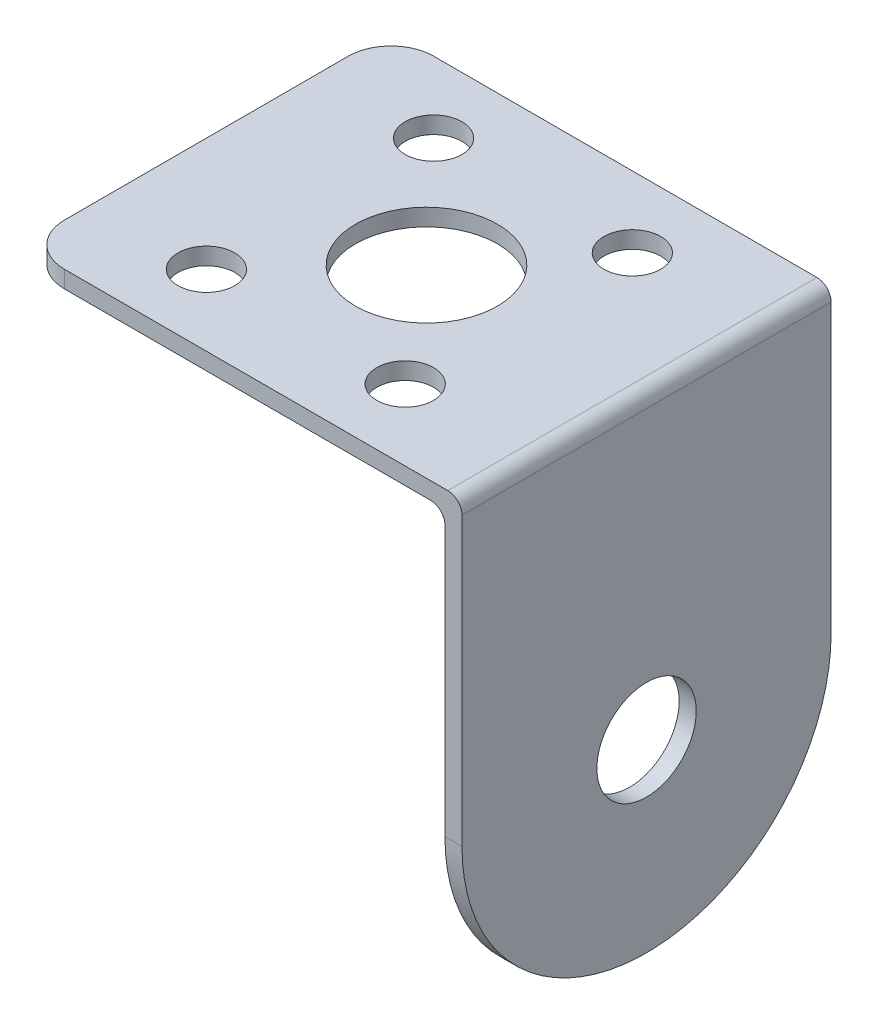
ISO-10303-21;
HEADER;
FILE_DESCRIPTION(('STEP AP214'),'2;1');
FILE_NAME('part.step','',(''),(''),'','','');
FILE_SCHEMA(('AUTOMOTIVE_DESIGN { 1 0 10303 214 1 1 1 1 }'));
ENDSEC;
DATA;
#1=APPLICATION_CONTEXT('core data for automotive mechanical design processes');
#2=APPLICATION_PROTOCOL_DEFINITION('international standard','automotive_design',2000,#1);
#3=PRODUCT_CONTEXT('',#1,'mechanical');
#4=PRODUCT('Part','Part','',(#3));
#5=PRODUCT_RELATED_PRODUCT_CATEGORY('part','',(#4));
#6=PRODUCT_DEFINITION_FORMATION('','',#4);
#7=PRODUCT_DEFINITION_CONTEXT('part definition',#1,'design');
#8=PRODUCT_DEFINITION('design','',#6,#7);
#9=PRODUCT_DEFINITION_SHAPE('','',#8);
#10=(LENGTH_UNIT() NAMED_UNIT(*) SI_UNIT(.MILLI.,.METRE.));
#11=(NAMED_UNIT(*) PLANE_ANGLE_UNIT() SI_UNIT($,.RADIAN.));
#12=(NAMED_UNIT(*) SI_UNIT($,.STERADIAN.) SOLID_ANGLE_UNIT());
#13=UNCERTAINTY_MEASURE_WITH_UNIT(LENGTH_MEASURE(1.E-05),#10,'distance_accuracy_value','');
#14=(GEOMETRIC_REPRESENTATION_CONTEXT(3) GLOBAL_UNCERTAINTY_ASSIGNED_CONTEXT((#13)) GLOBAL_UNIT_ASSIGNED_CONTEXT((#10,
#11,#12)) REPRESENTATION_CONTEXT('',''));
#15=CARTESIAN_POINT('',(0.,0.,0.));
#16=DIRECTION('',(0.,0.,1.));
#17=DIRECTION('',(1.,0.,0.));
#18=AXIS2_PLACEMENT_3D('',#15,#16,#17);
#19=CARTESIAN_POINT('',(15.5,1.2,-13.));
#20=DIRECTION('',(-1.,0.,0.));
#21=DIRECTION('',(0.,0.,1.));
#22=AXIS2_PLACEMENT_3D('',#19,#20,#21);
#23=PLANE('',#22);
#24=CARTESIAN_POINT('',(15.5,-20.,0.));
#25=DIRECTION('',(1.,0.,0.));
#26=DIRECTION('',(0.,0.,-1.));
#27=AXIS2_PLACEMENT_3D('',#24,#25,#26);
#28=CIRCLE('',#27,3.5);
#29=CARTESIAN_POINT('',(15.5,-20.,-3.5));
#30=VERTEX_POINT('',#29);
#31=EDGE_CURVE('E173',#30,#30,#28,.T.);
#32=ORIENTED_EDGE('',*,*,#31,.F.);
#33=EDGE_LOOP('',(#32));
#34=FACE_BOUND('',#33,.T.);
#35=DIRECTION('',(0.,-1.,0.));
#36=VECTOR('',#35,1.);
#37=CARTESIAN_POINT('',(15.5,1.2,-13.));
#38=LINE('',#37,#36);
#39=CARTESIAN_POINT('',(15.5,0.2,-13.));
#40=VERTEX_POINT('',#39);
#41=CARTESIAN_POINT('',(15.5,-20.,-13.));
#42=VERTEX_POINT('',#41);
#43=EDGE_CURVE('E170',#40,#42,#38,.T.);
#44=ORIENTED_EDGE('',*,*,#43,.F.);
#45=DIRECTION('',(0.,0.,-1.));
#46=VECTOR('',#45,1.);
#47=CARTESIAN_POINT('',(15.5,0.2,-13.));
#48=LINE('',#47,#46);
#49=CARTESIAN_POINT('',(15.5,0.2,13.));
#50=VERTEX_POINT('',#49);
#51=EDGE_CURVE('E210',#40,#50,#48,.F.);
#52=ORIENTED_EDGE('',*,*,#51,.T.);
#53=DIRECTION('',(0.,-1.,0.));
#54=VECTOR('',#53,1.);
#55=CARTESIAN_POINT('',(15.5,1.2,13.));
#56=LINE('',#55,#54);
#57=CARTESIAN_POINT('',(15.5,-20.,13.));
#58=VERTEX_POINT('',#57);
#59=EDGE_CURVE('E199',#50,#58,#56,.T.);
#60=ORIENTED_EDGE('',*,*,#59,.T.);
#61=CARTESIAN_POINT('',(15.5,-20.,0.));
#62=DIRECTION('',(1.,0.,0.));
#63=DIRECTION('',(0.,0.,-1.));
#64=AXIS2_PLACEMENT_3D('',#61,#62,#63);
#65=CIRCLE('',#64,13.);
#66=EDGE_CURVE('E172',#58,#42,#65,.T.);
#67=ORIENTED_EDGE('',*,*,#66,.T.);
#68=EDGE_LOOP('',(#44,#52,#60,#67));
#69=FACE_BOUND('',#68,.T.);
#70=ADVANCED_FACE('F74',(#34,#69),#23,.F.);
#71=CARTESIAN_POINT('',(14.3,-33.,13.));
#72=DIRECTION('',(1.,0.,0.));
#73=DIRECTION('',(0.,0.,-1.));
#74=AXIS2_PLACEMENT_3D('',#71,#72,#73);
#75=PLANE('',#74);
#76=CARTESIAN_POINT('',(14.3,-20.,0.));
#77=DIRECTION('',(1.,0.,0.));
#78=DIRECTION('',(0.,0.,-1.));
#79=AXIS2_PLACEMENT_3D('',#76,#77,#78);
#80=CIRCLE('',#79,3.5);
#81=CARTESIAN_POINT('',(14.3,-20.,-3.5));
#82=VERTEX_POINT('',#81);
#83=EDGE_CURVE('E289',#82,#82,#80,.F.);
#84=ORIENTED_EDGE('',*,*,#83,.F.);
#85=EDGE_LOOP('',(#84));
#86=FACE_BOUND('',#85,.T.);
#87=DIRECTION('',(0.,1.,0.));
#88=VECTOR('',#87,1.);
#89=CARTESIAN_POINT('',(14.3,-33.,13.));
#90=LINE('',#89,#88);
#91=CARTESIAN_POINT('',(14.3,-20.,13.));
#92=VERTEX_POINT('',#91);
#93=CARTESIAN_POINT('',(14.3,-1.,13.));
#94=VERTEX_POINT('',#93);
#95=EDGE_CURVE('E179',#92,#94,#90,.T.);
#96=ORIENTED_EDGE('',*,*,#95,.T.);
#97=DIRECTION('',(0.,0.,-1.));
#98=VECTOR('',#97,1.);
#99=CARTESIAN_POINT('',(14.3,-1.,13.));
#100=LINE('',#99,#98);
#101=CARTESIAN_POINT('',(14.3,-1.,-13.));
#102=VERTEX_POINT('',#101);
#103=EDGE_CURVE('E178',#94,#102,#100,.T.);
#104=ORIENTED_EDGE('',*,*,#103,.T.);
#105=DIRECTION('',(0.,1.,0.));
#106=VECTOR('',#105,1.);
#107=CARTESIAN_POINT('',(14.3,-33.,-13.));
#108=LINE('',#107,#106);
#109=CARTESIAN_POINT('',(14.3,-20.,-13.));
#110=VERTEX_POINT('',#109);
#111=EDGE_CURVE('E165',#110,#102,#108,.T.);
#112=ORIENTED_EDGE('',*,*,#111,.F.);
#113=CARTESIAN_POINT('',(14.3,-20.,0.));
#114=DIRECTION('',(1.,0.,0.));
#115=DIRECTION('',(0.,0.,-1.));
#116=AXIS2_PLACEMENT_3D('',#113,#114,#115);
#117=CIRCLE('',#116,13.);
#118=EDGE_CURVE('E154',#110,#92,#117,.F.);
#119=ORIENTED_EDGE('',*,*,#118,.T.);
#120=EDGE_LOOP('',(#96,#104,#112,#119));
#121=FACE_BOUND('',#120,.T.);
#122=ADVANCED_FACE('F176',(#86,#121),#75,.F.);
#123=CARTESIAN_POINT('',(15.5,1.2,-13.));
#124=DIRECTION('',(0.,0.,1.));
#125=DIRECTION('',(1.,0.,0.));
#126=AXIS2_PLACEMENT_3D('',#123,#124,#125);
#127=PLANE('',#126);
#128=DIRECTION('',(-1.,0.,0.));
#129=VECTOR('',#128,1.);
#130=CARTESIAN_POINT('',(15.5,0.,-13.));
#131=LINE('',#130,#129);
#132=CARTESIAN_POINT('',(13.3,0.,-13.));
#133=VERTEX_POINT('',#132);
#134=CARTESIAN_POINT('',(-12.5,0.,-13.));
#135=VERTEX_POINT('',#134);
#136=EDGE_CURVE('E189',#133,#135,#131,.T.);
#137=ORIENTED_EDGE('',*,*,#136,.T.);
#138=DIRECTION('',(0.,-1.,0.));
#139=VECTOR('',#138,1.);
#140=CARTESIAN_POINT('',(-12.5,1.2,-13.));
#141=LINE('',#140,#139);
#142=CARTESIAN_POINT('',(-12.5,1.2,-13.));
#143=VERTEX_POINT('',#142);
#144=EDGE_CURVE('E97',#135,#143,#141,.F.);
#145=ORIENTED_EDGE('',*,*,#144,.T.);
#146=DIRECTION('',(-1.,0.,0.));
#147=VECTOR('',#146,1.);
#148=CARTESIAN_POINT('',(15.5,1.2,-13.));
#149=LINE('',#148,#147);
#150=CARTESIAN_POINT('',(14.5,1.2,-13.));
#151=VERTEX_POINT('',#150);
#152=EDGE_CURVE('E191',#151,#143,#149,.T.);
#153=ORIENTED_EDGE('',*,*,#152,.F.);
#154=CARTESIAN_POINT('',(14.5,0.2,-13.));
#155=DIRECTION('',(0.,0.,1.));
#156=DIRECTION('',(1.,0.,0.));
#157=AXIS2_PLACEMENT_3D('',#154,#155,#156);
#158=CIRCLE('',#157,1.);
#159=EDGE_CURVE('E208',#151,#40,#158,.F.);
#160=ORIENTED_EDGE('',*,*,#159,.T.);
#161=ORIENTED_EDGE('',*,*,#43,.T.);
#162=DIRECTION('',(1.,0.,0.));
#163=VECTOR('',#162,1.);
#164=CARTESIAN_POINT('',(-4.08477631085024,-20.,-13.));
#165=LINE('',#164,#163);
#166=EDGE_CURVE('E158',#110,#42,#165,.T.);
#167=ORIENTED_EDGE('',*,*,#166,.F.);
#168=ORIENTED_EDGE('',*,*,#111,.T.);
#169=CARTESIAN_POINT('',(13.3,-1.,-13.));
#170=DIRECTION('',(0.,0.,1.));
#171=DIRECTION('',(1.,0.,0.));
#172=AXIS2_PLACEMENT_3D('',#169,#170,#171);
#173=CIRCLE('',#172,1.);
#174=EDGE_CURVE('E215',#102,#133,#173,.T.);
#175=ORIENTED_EDGE('',*,*,#174,.T.);
#176=EDGE_LOOP('',(#137,#145,#153,#160,#161,#167,#168,#175));
#177=FACE_BOUND('',#176,.T.);
#178=ADVANCED_FACE('F168',(#177),#127,.F.);
#179=CARTESIAN_POINT('',(-15.5,1.2,-13.));
#180=DIRECTION('',(1.,0.,0.));
#181=DIRECTION('',(0.,0.,-1.));
#182=AXIS2_PLACEMENT_3D('',#179,#180,#181);
#183=PLANE('',#182);
#184=DIRECTION('',(0.,0.,1.));
#185=VECTOR('',#184,1.);
#186=CARTESIAN_POINT('',(-15.5,1.2,-13.));
#187=LINE('',#186,#185);
#188=CARTESIAN_POINT('',(-15.5,1.2,-10.));
#189=VERTEX_POINT('',#188);
#190=CARTESIAN_POINT('',(-15.5,1.2,9.99999999999999));
#191=VERTEX_POINT('',#190);
#192=EDGE_CURVE('E186',#189,#191,#187,.T.);
#193=ORIENTED_EDGE('',*,*,#192,.F.);
#194=DIRECTION('',(0.,-1.,0.));
#195=VECTOR('',#194,1.);
#196=CARTESIAN_POINT('',(-15.5,1.2,-10.));
#197=LINE('',#196,#195);
#198=CARTESIAN_POINT('',(-15.5,0.,-10.));
#199=VERTEX_POINT('',#198);
#200=EDGE_CURVE('E221',#189,#199,#197,.T.);
#201=ORIENTED_EDGE('',*,*,#200,.T.);
#202=DIRECTION('',(0.,0.,1.));
#203=VECTOR('',#202,1.);
#204=CARTESIAN_POINT('',(-15.5,0.,-13.));
#205=LINE('',#204,#203);
#206=CARTESIAN_POINT('',(-15.5,0.,9.99999999999999));
#207=VERTEX_POINT('',#206);
#208=EDGE_CURVE('E181',#199,#207,#205,.T.);
#209=ORIENTED_EDGE('',*,*,#208,.T.);
#210=DIRECTION('',(0.,-1.,0.));
#211=VECTOR('',#210,1.);
#212=CARTESIAN_POINT('',(-15.5,1.2,10.));
#213=LINE('',#212,#211);
#214=EDGE_CURVE('E219',#207,#191,#213,.F.);
#215=ORIENTED_EDGE('',*,*,#214,.T.);
#216=EDGE_LOOP('',(#193,#201,#209,#215));
#217=FACE_BOUND('',#216,.T.);
#218=ADVANCED_FACE('F235',(#217),#183,.F.);
#219=CARTESIAN_POINT('',(15.5,1.2,13.));
#220=DIRECTION('',(0.,0.,-1.));
#221=DIRECTION('',(-1.,0.,0.));
#222=AXIS2_PLACEMENT_3D('',#219,#220,#221);
#223=PLANE('',#222);
#224=DIRECTION('',(1.,0.,0.));
#225=VECTOR('',#224,1.);
#226=CARTESIAN_POINT('',(15.5,1.2,13.));
#227=LINE('',#226,#225);
#228=CARTESIAN_POINT('',(-12.5,1.2,13.));
#229=VERTEX_POINT('',#228);
#230=CARTESIAN_POINT('',(14.5,1.2,13.));
#231=VERTEX_POINT('',#230);
#232=EDGE_CURVE('E188',#229,#231,#227,.T.);
#233=ORIENTED_EDGE('',*,*,#232,.F.);
#234=DIRECTION('',(0.,-1.,0.));
#235=VECTOR('',#234,1.);
#236=CARTESIAN_POINT('',(-12.5,1.2,13.));
#237=LINE('',#236,#235);
#238=CARTESIAN_POINT('',(-12.5,0.,13.));
#239=VERTEX_POINT('',#238);
#240=EDGE_CURVE('E12',#229,#239,#237,.T.);
#241=ORIENTED_EDGE('',*,*,#240,.T.);
#242=DIRECTION('',(1.,0.,0.));
#243=VECTOR('',#242,1.);
#244=CARTESIAN_POINT('',(15.5,0.,13.));
#245=LINE('',#244,#243);
#246=CARTESIAN_POINT('',(13.3,0.,13.));
#247=VERTEX_POINT('',#246);
#248=EDGE_CURVE('E195',#239,#247,#245,.T.);
#249=ORIENTED_EDGE('',*,*,#248,.T.);
#250=CARTESIAN_POINT('',(13.3,-1.,13.));
#251=DIRECTION('',(0.,0.,-1.));
#252=DIRECTION('',(-1.,0.,0.));
#253=AXIS2_PLACEMENT_3D('',#250,#251,#252);
#254=CIRCLE('',#253,1.);
#255=EDGE_CURVE('E217',#247,#94,#254,.T.);
#256=ORIENTED_EDGE('',*,*,#255,.T.);
#257=ORIENTED_EDGE('',*,*,#95,.F.);
#258=DIRECTION('',(1.,0.,0.));
#259=VECTOR('',#258,1.);
#260=CARTESIAN_POINT('',(-4.08477631085023,-20.,13.));
#261=LINE('',#260,#259);
#262=EDGE_CURVE('E160',#92,#58,#261,.T.);
#263=ORIENTED_EDGE('',*,*,#262,.T.);
#264=ORIENTED_EDGE('',*,*,#59,.F.);
#265=CARTESIAN_POINT('',(14.5,0.2,13.));
#266=DIRECTION('',(0.,0.,-1.));
#267=DIRECTION('',(-1.,0.,0.));
#268=AXIS2_PLACEMENT_3D('',#265,#266,#267);
#269=CIRCLE('',#268,1.);
#270=EDGE_CURVE('E212',#50,#231,#269,.F.);
#271=ORIENTED_EDGE('',*,*,#270,.T.);
#272=EDGE_LOOP('',(#233,#241,#249,#256,#257,#263,#264,#271));
#273=FACE_BOUND('',#272,.T.);
#274=ADVANCED_FACE('F248',(#273),#223,.F.);
#275=CARTESIAN_POINT('',(0.,1.2,0.));
#276=DIRECTION('',(0.,-1.,0.));
#277=DIRECTION('',(0.,0.,-1.));
#278=AXIS2_PLACEMENT_3D('',#275,#276,#277);
#279=PLANE('',#278);
#280=CARTESIAN_POINT('',(-7.5,1.2,7.99999999999999));
#281=DIRECTION('',(0.,1.,0.));
#282=DIRECTION('',(0.,0.,-1.));
#283=AXIS2_PLACEMENT_3D('',#280,#281,#282);
#284=CIRCLE('',#283,2.);
#285=CARTESIAN_POINT('',(-7.5,1.2,5.99999999999999));
#286=VERTEX_POINT('',#285);
#287=EDGE_CURVE('E299',#286,#286,#284,.T.);
#288=ORIENTED_EDGE('',*,*,#287,.F.);
#289=EDGE_LOOP('',(#288));
#290=FACE_BOUND('',#289,.T.);
#291=CARTESIAN_POINT('',(6.5,1.2,8.));
#292=DIRECTION('',(0.,1.,0.));
#293=DIRECTION('',(0.,0.,-1.));
#294=AXIS2_PLACEMENT_3D('',#291,#292,#293);
#295=CIRCLE('',#294,2.);
#296=CARTESIAN_POINT('',(6.5,1.2,6.));
#297=VERTEX_POINT('',#296);
#298=EDGE_CURVE('E306',#297,#297,#295,.T.);
#299=ORIENTED_EDGE('',*,*,#298,.F.);
#300=EDGE_LOOP('',(#299));
#301=FACE_BOUND('',#300,.T.);
#302=CARTESIAN_POINT('',(6.5,1.2,-8.));
#303=DIRECTION('',(0.,1.,0.));
#304=DIRECTION('',(0.,0.,1.));
#305=AXIS2_PLACEMENT_3D('',#302,#303,#304);
#306=CIRCLE('',#305,2.);
#307=CARTESIAN_POINT('',(6.5,1.2,-6.));
#308=VERTEX_POINT('',#307);
#309=EDGE_CURVE('E312',#308,#308,#306,.T.);
#310=ORIENTED_EDGE('',*,*,#309,.F.);
#311=EDGE_LOOP('',(#310));
#312=FACE_BOUND('',#311,.T.);
#313=CARTESIAN_POINT('',(-7.5,1.2,-8.));
#314=DIRECTION('',(0.,1.,0.));
#315=DIRECTION('',(0.,0.,1.));
#316=AXIS2_PLACEMENT_3D('',#313,#314,#315);
#317=CIRCLE('',#316,2.);
#318=CARTESIAN_POINT('',(-7.5,1.2,-6.));
#319=VERTEX_POINT('',#318);
#320=EDGE_CURVE('E298',#319,#319,#317,.T.);
#321=ORIENTED_EDGE('',*,*,#320,.F.);
#322=EDGE_LOOP('',(#321));
#323=FACE_BOUND('',#322,.T.);
#324=CARTESIAN_POINT('',(0.,1.2,0.));
#325=DIRECTION('',(0.,1.,0.));
#326=DIRECTION('',(0.,0.,1.));
#327=AXIS2_PLACEMENT_3D('',#324,#325,#326);
#328=CIRCLE('',#327,5.);
#329=CARTESIAN_POINT('',(0.,1.2,5.));
#330=VERTEX_POINT('',#329);
#331=EDGE_CURVE('E295',#330,#330,#328,.T.);
#332=ORIENTED_EDGE('',*,*,#331,.F.);
#333=EDGE_LOOP('',(#332));
#334=FACE_BOUND('',#333,.T.);
#335=ORIENTED_EDGE('',*,*,#152,.T.);
#336=CARTESIAN_POINT('',(-12.5,1.2,-10.));
#337=DIRECTION('',(0.,-1.,0.));
#338=DIRECTION('',(0.,0.,-1.));
#339=AXIS2_PLACEMENT_3D('',#336,#337,#338);
#340=CIRCLE('',#339,3.);
#341=EDGE_CURVE('E82',#143,#189,#340,.F.);
#342=ORIENTED_EDGE('',*,*,#341,.T.);
#343=ORIENTED_EDGE('',*,*,#192,.T.);
#344=CARTESIAN_POINT('',(-12.5,1.2,10.));
#345=DIRECTION('',(0.,-1.,0.));
#346=DIRECTION('',(0.,0.,-1.));
#347=AXIS2_PLACEMENT_3D('',#344,#345,#346);
#348=CIRCLE('',#347,3.);
#349=EDGE_CURVE('E89',#191,#229,#348,.F.);
#350=ORIENTED_EDGE('',*,*,#349,.T.);
#351=ORIENTED_EDGE('',*,*,#232,.T.);
#352=DIRECTION('',(0.,0.,-1.));
#353=VECTOR('',#352,1.);
#354=CARTESIAN_POINT('',(14.5,1.2,0.));
#355=LINE('',#354,#353);
#356=EDGE_CURVE('E205',#231,#151,#355,.T.);
#357=ORIENTED_EDGE('',*,*,#356,.T.);
#358=EDGE_LOOP('',(#335,#342,#343,#350,#351,#357));
#359=FACE_BOUND('',#358,.T.);
#360=ADVANCED_FACE('F231',(#290,#301,#312,#323,#334,#359),#279,.F.);
#361=CARTESIAN_POINT('',(0.,0.,0.));
#362=DIRECTION('',(0.,-1.,0.));
#363=DIRECTION('',(0.,0.,-1.));
#364=AXIS2_PLACEMENT_3D('',#361,#362,#363);
#365=PLANE('',#364);
#366=CARTESIAN_POINT('',(-7.5,0.,7.99999999999999));
#367=DIRECTION('',(0.,-1.,0.));
#368=DIRECTION('',(0.,0.,-1.));
#369=AXIS2_PLACEMENT_3D('',#366,#367,#368);
#370=CIRCLE('',#369,2.);
#371=CARTESIAN_POINT('',(-7.5,0.,5.99999999999999));
#372=VERTEX_POINT('',#371);
#373=EDGE_CURVE('E303',#372,#372,#370,.F.);
#374=ORIENTED_EDGE('',*,*,#373,.T.);
#375=EDGE_LOOP('',(#374));
#376=FACE_BOUND('',#375,.T.);
#377=CARTESIAN_POINT('',(6.5,0.,8.));
#378=DIRECTION('',(0.,-1.,0.));
#379=DIRECTION('',(0.,0.,-1.));
#380=AXIS2_PLACEMENT_3D('',#377,#378,#379);
#381=CIRCLE('',#380,2.);
#382=CARTESIAN_POINT('',(6.5,0.,6.));
#383=VERTEX_POINT('',#382);
#384=EDGE_CURVE('E302',#383,#383,#381,.F.);
#385=ORIENTED_EDGE('',*,*,#384,.T.);
#386=EDGE_LOOP('',(#385));
#387=FACE_BOUND('',#386,.T.);
#388=CARTESIAN_POINT('',(6.5,0.,-8.));
#389=DIRECTION('',(0.,-1.,0.));
#390=DIRECTION('',(0.,0.,-1.));
#391=AXIS2_PLACEMENT_3D('',#388,#389,#390);
#392=CIRCLE('',#391,2.);
#393=CARTESIAN_POINT('',(6.5,0.,-10.));
#394=VERTEX_POINT('',#393);
#395=EDGE_CURVE('E309',#394,#394,#392,.F.);
#396=ORIENTED_EDGE('',*,*,#395,.T.);
#397=EDGE_LOOP('',(#396));
#398=FACE_BOUND('',#397,.T.);
#399=CARTESIAN_POINT('',(-7.5,0.,-8.));
#400=DIRECTION('',(0.,-1.,0.));
#401=DIRECTION('',(0.,0.,-1.));
#402=AXIS2_PLACEMENT_3D('',#399,#400,#401);
#403=CIRCLE('',#402,2.);
#404=CARTESIAN_POINT('',(-7.5,0.,-10.));
#405=VERTEX_POINT('',#404);
#406=EDGE_CURVE('E315',#405,#405,#403,.F.);
#407=ORIENTED_EDGE('',*,*,#406,.T.);
#408=EDGE_LOOP('',(#407));
#409=FACE_BOUND('',#408,.T.);
#410=CARTESIAN_POINT('',(0.,0.,0.));
#411=DIRECTION('',(0.,-1.,0.));
#412=DIRECTION('',(0.,0.,-1.));
#413=AXIS2_PLACEMENT_3D('',#410,#411,#412);
#414=CIRCLE('',#413,5.);
#415=CARTESIAN_POINT('',(0.,0.,-5.));
#416=VERTEX_POINT('',#415);
#417=EDGE_CURVE('E292',#416,#416,#414,.F.);
#418=ORIENTED_EDGE('',*,*,#417,.T.);
#419=EDGE_LOOP('',(#418));
#420=FACE_BOUND('',#419,.T.);
#421=ORIENTED_EDGE('',*,*,#208,.F.);
#422=CARTESIAN_POINT('',(-12.5,0.,-10.));
#423=DIRECTION('',(0.,-1.,0.));
#424=DIRECTION('',(0.,0.,-1.));
#425=AXIS2_PLACEMENT_3D('',#422,#423,#424);
#426=CIRCLE('',#425,3.);
#427=EDGE_CURVE('E226',#199,#135,#426,.T.);
#428=ORIENTED_EDGE('',*,*,#427,.T.);
#429=ORIENTED_EDGE('',*,*,#136,.F.);
#430=DIRECTION('',(0.,0.,-1.));
#431=VECTOR('',#430,1.);
#432=CARTESIAN_POINT('',(13.3,0.,0.));
#433=LINE('',#432,#431);
#434=EDGE_CURVE('E202',#133,#247,#433,.F.);
#435=ORIENTED_EDGE('',*,*,#434,.T.);
#436=ORIENTED_EDGE('',*,*,#248,.F.);
#437=CARTESIAN_POINT('',(-12.5,0.,10.));
#438=DIRECTION('',(0.,-1.,0.));
#439=DIRECTION('',(0.,0.,-1.));
#440=AXIS2_PLACEMENT_3D('',#437,#438,#439);
#441=CIRCLE('',#440,3.);
#442=EDGE_CURVE('E224',#239,#207,#441,.T.);
#443=ORIENTED_EDGE('',*,*,#442,.T.);
#444=EDGE_LOOP('',(#421,#428,#429,#435,#436,#443));
#445=FACE_BOUND('',#444,.T.);
#446=ADVANCED_FACE('F241',(#376,#387,#398,#409,#420,#445),#365,.T.);
#447=CARTESIAN_POINT('',(-4.08477631085023,-20.,0.));
#448=DIRECTION('',(1.,0.,0.));
#449=DIRECTION('',(0.,0.,-1.));
#450=AXIS2_PLACEMENT_3D('',#447,#448,#449);
#451=CYLINDRICAL_SURFACE('',#450,13.);
#452=ORIENTED_EDGE('',*,*,#118,.F.);
#453=ORIENTED_EDGE('',*,*,#166,.T.);
#454=ORIENTED_EDGE('',*,*,#66,.F.);
#455=ORIENTED_EDGE('',*,*,#262,.F.);
#456=EDGE_LOOP('',(#452,#453,#454,#455));
#457=FACE_BOUND('',#456,.T.);
#458=ADVANCED_FACE('F156',(#457),#451,.T.);
#459=CARTESIAN_POINT('',(-4.08477631085023,-20.,0.));
#460=DIRECTION('',(1.,0.,0.));
#461=DIRECTION('',(0.,0.,-1.));
#462=AXIS2_PLACEMENT_3D('',#459,#460,#461);
#463=CYLINDRICAL_SURFACE('',#462,3.5);
#464=ORIENTED_EDGE('',*,*,#83,.T.);
#465=EDGE_LOOP('',(#464));
#466=FACE_BOUND('',#465,.T.);
#467=ORIENTED_EDGE('',*,*,#31,.T.);
#468=EDGE_LOOP('',(#467));
#469=FACE_BOUND('',#468,.T.);
#470=ADVANCED_FACE('F338',(#466,#469),#463,.F.);
#471=CARTESIAN_POINT('',(0.,-14.142135623731,0.));
#472=DIRECTION('',(0.,1.,0.));
#473=DIRECTION('',(0.,0.,1.));
#474=AXIS2_PLACEMENT_3D('',#471,#472,#473);
#475=CYLINDRICAL_SURFACE('',#474,5.);
#476=ORIENTED_EDGE('',*,*,#331,.T.);
#477=EDGE_LOOP('',(#476));
#478=FACE_BOUND('',#477,.T.);
#479=ORIENTED_EDGE('',*,*,#417,.F.);
#480=EDGE_LOOP('',(#479));
#481=FACE_BOUND('',#480,.T.);
#482=ADVANCED_FACE('F328',(#478,#481),#475,.F.);
#483=CARTESIAN_POINT('',(-7.5,-14.142135623731,-8.));
#484=DIRECTION('',(0.,1.,0.));
#485=DIRECTION('',(0.,0.,1.));
#486=AXIS2_PLACEMENT_3D('',#483,#484,#485);
#487=CYLINDRICAL_SURFACE('',#486,2.);
#488=ORIENTED_EDGE('',*,*,#320,.T.);
#489=EDGE_LOOP('',(#488));
#490=FACE_BOUND('',#489,.T.);
#491=ORIENTED_EDGE('',*,*,#406,.F.);
#492=EDGE_LOOP('',(#491));
#493=FACE_BOUND('',#492,.T.);
#494=ADVANCED_FACE('F325',(#490,#493),#487,.F.);
#495=CARTESIAN_POINT('',(6.5,-14.142135623731,-8.));
#496=DIRECTION('',(0.,1.,0.));
#497=DIRECTION('',(0.,0.,1.));
#498=AXIS2_PLACEMENT_3D('',#495,#496,#497);
#499=CYLINDRICAL_SURFACE('',#498,2.);
#500=ORIENTED_EDGE('',*,*,#309,.T.);
#501=EDGE_LOOP('',(#500));
#502=FACE_BOUND('',#501,.T.);
#503=ORIENTED_EDGE('',*,*,#395,.F.);
#504=EDGE_LOOP('',(#503));
#505=FACE_BOUND('',#504,.T.);
#506=ADVANCED_FACE('F327',(#502,#505),#499,.F.);
#507=CARTESIAN_POINT('',(6.5,-14.142135623731,8.));
#508=DIRECTION('',(0.,1.,0.));
#509=DIRECTION('',(0.,0.,1.));
#510=AXIS2_PLACEMENT_3D('',#507,#508,#509);
#511=CYLINDRICAL_SURFACE('',#510,2.);
#512=ORIENTED_EDGE('',*,*,#298,.T.);
#513=EDGE_LOOP('',(#512));
#514=FACE_BOUND('',#513,.T.);
#515=ORIENTED_EDGE('',*,*,#384,.F.);
#516=EDGE_LOOP('',(#515));
#517=FACE_BOUND('',#516,.T.);
#518=ADVANCED_FACE('F335',(#514,#517),#511,.F.);
#519=CARTESIAN_POINT('',(-7.5,-14.142135623731,7.99999999999999));
#520=DIRECTION('',(0.,1.,0.));
#521=DIRECTION('',(0.,0.,1.));
#522=AXIS2_PLACEMENT_3D('',#519,#520,#521);
#523=CYLINDRICAL_SURFACE('',#522,2.);
#524=ORIENTED_EDGE('',*,*,#287,.T.);
#525=EDGE_LOOP('',(#524));
#526=FACE_BOUND('',#525,.T.);
#527=ORIENTED_EDGE('',*,*,#373,.F.);
#528=EDGE_LOOP('',(#527));
#529=FACE_BOUND('',#528,.T.);
#530=ADVANCED_FACE('F276',(#526,#529),#523,.F.);
#531=CARTESIAN_POINT('',(13.3,-1.,13.));
#532=DIRECTION('',(0.,0.,-1.));
#533=DIRECTION('',(-1.,0.,0.));
#534=AXIS2_PLACEMENT_3D('',#531,#532,#533);
#535=CYLINDRICAL_SURFACE('',#534,1.);
#536=ORIENTED_EDGE('',*,*,#255,.F.);
#537=ORIENTED_EDGE('',*,*,#434,.F.);
#538=ORIENTED_EDGE('',*,*,#174,.F.);
#539=ORIENTED_EDGE('',*,*,#103,.F.);
#540=EDGE_LOOP('',(#536,#537,#538,#539));
#541=FACE_BOUND('',#540,.T.);
#542=ADVANCED_FACE('F245',(#541),#535,.F.);
#543=CARTESIAN_POINT('',(14.5,0.2,0.));
#544=DIRECTION('',(0.,0.,-1.));
#545=DIRECTION('',(-1.,0.,0.));
#546=AXIS2_PLACEMENT_3D('',#543,#544,#545);
#547=CYLINDRICAL_SURFACE('',#546,1.);
#548=ORIENTED_EDGE('',*,*,#270,.F.);
#549=ORIENTED_EDGE('',*,*,#51,.F.);
#550=ORIENTED_EDGE('',*,*,#159,.F.);
#551=ORIENTED_EDGE('',*,*,#356,.F.);
#552=EDGE_LOOP('',(#548,#549,#550,#551));
#553=FACE_BOUND('',#552,.T.);
#554=ADVANCED_FACE('F255',(#553),#547,.T.);
#555=CARTESIAN_POINT('',(-12.5,1.2,-10.));
#556=DIRECTION('',(0.,-1.,0.));
#557=DIRECTION('',(0.,0.,-1.));
#558=AXIS2_PLACEMENT_3D('',#555,#556,#557);
#559=CYLINDRICAL_SURFACE('',#558,3.);
#560=ORIENTED_EDGE('',*,*,#341,.F.);
#561=ORIENTED_EDGE('',*,*,#144,.F.);
#562=ORIENTED_EDGE('',*,*,#427,.F.);
#563=ORIENTED_EDGE('',*,*,#200,.F.);
#564=EDGE_LOOP('',(#560,#561,#562,#563));
#565=FACE_BOUND('',#564,.T.);
#566=ADVANCED_FACE('F238',(#565),#559,.T.);
#567=CARTESIAN_POINT('',(-12.5,1.2,10.));
#568=DIRECTION('',(0.,-1.,0.));
#569=DIRECTION('',(0.,0.,-1.));
#570=AXIS2_PLACEMENT_3D('',#567,#568,#569);
#571=CYLINDRICAL_SURFACE('',#570,3.);
#572=ORIENTED_EDGE('',*,*,#349,.F.);
#573=ORIENTED_EDGE('',*,*,#214,.F.);
#574=ORIENTED_EDGE('',*,*,#442,.F.);
#575=ORIENTED_EDGE('',*,*,#240,.F.);
#576=EDGE_LOOP('',(#572,#573,#574,#575));
#577=FACE_BOUND('',#576,.T.);
#578=ADVANCED_FACE('F76',(#577),#571,.T.);
#579=CLOSED_SHELL('',(#70,#122,#178,#218,#274,#360,#446,#458,#470,#482,#494,#506,#518,#530,#542,
#554,#566,#578));
#580=MANIFOLD_SOLID_BREP('B2',#579);
#581=ADVANCED_BREP_SHAPE_REPRESENTATION('',(#18,#580),#14);
#582=SHAPE_DEFINITION_REPRESENTATION(#9,#581);
ENDSEC;
END-ISO-10303-21;
